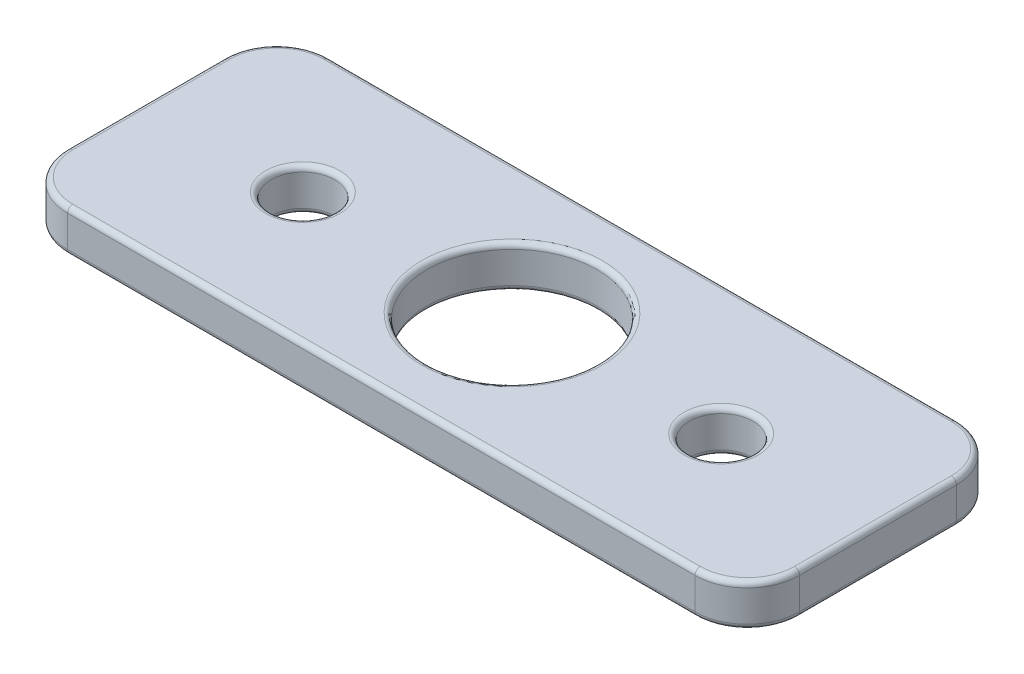
ISO-10303-21;
HEADER;
FILE_DESCRIPTION(('STEP AP214'),'2;1');
FILE_NAME('part.step','',(''),(''),'','','');
FILE_SCHEMA(('AUTOMOTIVE_DESIGN { 1 0 10303 214 1 1 1 1 }'));
ENDSEC;
DATA;
#1=APPLICATION_CONTEXT('core data for automotive mechanical design processes');
#2=APPLICATION_PROTOCOL_DEFINITION('international standard','automotive_design',2000,#1);
#3=PRODUCT_CONTEXT('',#1,'mechanical');
#4=PRODUCT('Part','Part','',(#3));
#5=PRODUCT_RELATED_PRODUCT_CATEGORY('part','',(#4));
#6=PRODUCT_DEFINITION_FORMATION('','',#4);
#7=PRODUCT_DEFINITION_CONTEXT('part definition',#1,'design');
#8=PRODUCT_DEFINITION('design','',#6,#7);
#9=PRODUCT_DEFINITION_SHAPE('','',#8);
#10=(LENGTH_UNIT() NAMED_UNIT(*) SI_UNIT(.MILLI.,.METRE.));
#11=(NAMED_UNIT(*) PLANE_ANGLE_UNIT() SI_UNIT($,.RADIAN.));
#12=(NAMED_UNIT(*) SI_UNIT($,.STERADIAN.) SOLID_ANGLE_UNIT());
#13=UNCERTAINTY_MEASURE_WITH_UNIT(LENGTH_MEASURE(1.E-05),#10,'distance_accuracy_value','');
#14=(GEOMETRIC_REPRESENTATION_CONTEXT(3) GLOBAL_UNCERTAINTY_ASSIGNED_CONTEXT((#13)) GLOBAL_UNIT_ASSIGNED_CONTEXT((#10,
#11,#12)) REPRESENTATION_CONTEXT('',''));
#15=CARTESIAN_POINT('',(0.,0.,0.));
#16=DIRECTION('',(0.,0.,1.));
#17=DIRECTION('',(1.,0.,0.));
#18=AXIS2_PLACEMENT_3D('',#15,#16,#17);
#19=CARTESIAN_POINT('',(0.,4.,0.));
#20=DIRECTION('',(0.,-1.,0.));
#21=DIRECTION('',(0.,0.,-1.));
#22=AXIS2_PLACEMENT_3D('',#19,#20,#21);
#23=PLANE('',#22);
#24=CARTESIAN_POINT('',(55.,4.,-12.5));
#25=DIRECTION('',(0.,-1.,0.));
#26=DIRECTION('',(0.,0.,-1.));
#27=AXIS2_PLACEMENT_3D('',#24,#25,#26);
#28=CIRCLE('',#27,3.55000000000001);
#29=CARTESIAN_POINT('',(55.,4.,-16.05));
#30=VERTEX_POINT('',#29);
#31=EDGE_CURVE('E11',#30,#30,#28,.T.);
#32=ORIENTED_EDGE('',*,*,#31,.T.);
#33=EDGE_LOOP('',(#32));
#34=FACE_BOUND('',#33,.T.);
#35=CARTESIAN_POINT('',(35.,4.,-12.5));
#36=DIRECTION('',(0.,-1.,0.));
#37=DIRECTION('',(0.,0.,-1.));
#38=AXIS2_PLACEMENT_3D('',#35,#36,#37);
#39=CIRCLE('',#38,8.65);
#40=CARTESIAN_POINT('',(35.,4.,-21.15));
#41=VERTEX_POINT('',#40);
#42=EDGE_CURVE('E47',#41,#41,#39,.T.);
#43=ORIENTED_EDGE('',*,*,#42,.T.);
#44=EDGE_LOOP('',(#43));
#45=FACE_BOUND('',#44,.T.);
#46=CARTESIAN_POINT('',(15.,4.,-12.5));
#47=DIRECTION('',(0.,-1.,0.));
#48=DIRECTION('',(0.,0.,-1.));
#49=AXIS2_PLACEMENT_3D('',#46,#47,#48);
#50=CIRCLE('',#49,3.55);
#51=CARTESIAN_POINT('',(15.,4.,-16.05));
#52=VERTEX_POINT('',#51);
#53=EDGE_CURVE('E255',#52,#52,#50,.T.);
#54=ORIENTED_EDGE('',*,*,#53,.T.);
#55=EDGE_LOOP('',(#54));
#56=FACE_BOUND('',#55,.T.);
#57=DIRECTION('',(1.,0.,0.));
#58=VECTOR('',#57,1.);
#59=CARTESIAN_POINT('',(0.,4.,-0.5));
#60=LINE('',#59,#58);
#61=CARTESIAN_POINT('',(5.,4.,-0.5));
#62=VERTEX_POINT('',#61);
#63=CARTESIAN_POINT('',(65.,4.,-0.5));
#64=VERTEX_POINT('',#63);
#65=EDGE_CURVE('E55',#62,#64,#60,.T.);
#66=ORIENTED_EDGE('',*,*,#65,.T.);
#67=CARTESIAN_POINT('',(65.,4.,-5.));
#68=DIRECTION('',(0.,-1.,0.));
#69=DIRECTION('',(0.,0.,-1.));
#70=AXIS2_PLACEMENT_3D('',#67,#68,#69);
#71=CIRCLE('',#70,4.5);
#72=CARTESIAN_POINT('',(69.5,4.,-5.));
#73=VERTEX_POINT('',#72);
#74=EDGE_CURVE('E253',#64,#73,#71,.F.);
#75=ORIENTED_EDGE('',*,*,#74,.T.);
#76=DIRECTION('',(0.,0.,-1.));
#77=VECTOR('',#76,1.);
#78=CARTESIAN_POINT('',(69.5,4.,0.));
#79=LINE('',#78,#77);
#80=CARTESIAN_POINT('',(69.5,4.,-20.));
#81=VERTEX_POINT('',#80);
#82=EDGE_CURVE('E241',#73,#81,#79,.T.);
#83=ORIENTED_EDGE('',*,*,#82,.T.);
#84=CARTESIAN_POINT('',(65.,4.,-20.));
#85=DIRECTION('',(0.,-1.,0.));
#86=DIRECTION('',(0.,0.,-1.));
#87=AXIS2_PLACEMENT_3D('',#84,#85,#86);
#88=CIRCLE('',#87,4.5);
#89=CARTESIAN_POINT('',(65.,4.,-24.5));
#90=VERTEX_POINT('',#89);
#91=EDGE_CURVE('E243',#81,#90,#88,.F.);
#92=ORIENTED_EDGE('',*,*,#91,.T.);
#93=DIRECTION('',(-1.,0.,0.));
#94=VECTOR('',#93,1.);
#95=CARTESIAN_POINT('',(0.,4.,-24.5));
#96=LINE('',#95,#94);
#97=CARTESIAN_POINT('',(5.,4.,-24.5));
#98=VERTEX_POINT('',#97);
#99=EDGE_CURVE('E245',#90,#98,#96,.T.);
#100=ORIENTED_EDGE('',*,*,#99,.T.);
#101=CARTESIAN_POINT('',(5.,4.,-20.));
#102=DIRECTION('',(0.,-1.,0.));
#103=DIRECTION('',(0.,0.,-1.));
#104=AXIS2_PLACEMENT_3D('',#101,#102,#103);
#105=CIRCLE('',#104,4.5);
#106=CARTESIAN_POINT('',(0.5,4.,-20.));
#107=VERTEX_POINT('',#106);
#108=EDGE_CURVE('E247',#98,#107,#105,.F.);
#109=ORIENTED_EDGE('',*,*,#108,.T.);
#110=DIRECTION('',(0.,0.,1.));
#111=VECTOR('',#110,1.);
#112=CARTESIAN_POINT('',(0.5,4.,0.));
#113=LINE('',#112,#111);
#114=CARTESIAN_POINT('',(0.5,4.,-5.));
#115=VERTEX_POINT('',#114);
#116=EDGE_CURVE('E249',#107,#115,#113,.T.);
#117=ORIENTED_EDGE('',*,*,#116,.T.);
#118=CARTESIAN_POINT('',(5.,4.,-5.));
#119=DIRECTION('',(0.,-1.,0.));
#120=DIRECTION('',(0.,0.,-1.));
#121=AXIS2_PLACEMENT_3D('',#118,#119,#120);
#122=CIRCLE('',#121,4.5);
#123=EDGE_CURVE('E60',#115,#62,#122,.F.);
#124=ORIENTED_EDGE('',*,*,#123,.T.);
#125=EDGE_LOOP('',(#66,#75,#83,#92,#100,#109,#117,#124));
#126=FACE_BOUND('',#125,.T.);
#127=ADVANCED_FACE('F38',(#34,#45,#56,#126),#23,.F.);
#128=CARTESIAN_POINT('',(0.,0.,0.));
#129=DIRECTION('',(0.,-1.,0.));
#130=DIRECTION('',(0.,0.,-1.));
#131=AXIS2_PLACEMENT_3D('',#128,#129,#130);
#132=PLANE('',#131);
#133=CARTESIAN_POINT('',(55.,0.,-12.5));
#134=DIRECTION('',(0.,-1.,0.));
#135=DIRECTION('',(0.,0.,-1.));
#136=AXIS2_PLACEMENT_3D('',#133,#134,#135);
#137=CIRCLE('',#136,3.55000000000001);
#138=CARTESIAN_POINT('',(55.,0.,-16.05));
#139=VERTEX_POINT('',#138);
#140=EDGE_CURVE('E183',#139,#139,#137,.F.);
#141=ORIENTED_EDGE('',*,*,#140,.T.);
#142=EDGE_LOOP('',(#141));
#143=FACE_BOUND('',#142,.T.);
#144=CARTESIAN_POINT('',(15.,0.,-12.5));
#145=DIRECTION('',(0.,-1.,0.));
#146=DIRECTION('',(0.,0.,-1.));
#147=AXIS2_PLACEMENT_3D('',#144,#145,#146);
#148=CIRCLE('',#147,3.55);
#149=CARTESIAN_POINT('',(15.,0.,-16.05));
#150=VERTEX_POINT('',#149);
#151=EDGE_CURVE('E180',#150,#150,#148,.F.);
#152=ORIENTED_EDGE('',*,*,#151,.T.);
#153=EDGE_LOOP('',(#152));
#154=FACE_BOUND('',#153,.T.);
#155=DIRECTION('',(0.,0.,1.));
#156=VECTOR('',#155,1.);
#157=CARTESIAN_POINT('',(0.5,0.,-20.));
#158=LINE('',#157,#156);
#159=CARTESIAN_POINT('',(0.5,0.,-5.));
#160=VERTEX_POINT('',#159);
#161=CARTESIAN_POINT('',(0.5,0.,-20.));
#162=VERTEX_POINT('',#161);
#163=EDGE_CURVE('E178',#160,#162,#158,.F.);
#164=ORIENTED_EDGE('',*,*,#163,.T.);
#165=CARTESIAN_POINT('',(5.,0.,-20.));
#166=DIRECTION('',(0.,-1.,0.));
#167=DIRECTION('',(0.,0.,-1.));
#168=AXIS2_PLACEMENT_3D('',#165,#166,#167);
#169=CIRCLE('',#168,4.5);
#170=CARTESIAN_POINT('',(5.,0.,-24.5));
#171=VERTEX_POINT('',#170);
#172=EDGE_CURVE('E158',#162,#171,#169,.T.);
#173=ORIENTED_EDGE('',*,*,#172,.T.);
#174=DIRECTION('',(-1.,0.,0.));
#175=VECTOR('',#174,1.);
#176=CARTESIAN_POINT('',(65.,0.,-24.5));
#177=LINE('',#176,#175);
#178=CARTESIAN_POINT('',(65.,0.,-24.5));
#179=VERTEX_POINT('',#178);
#180=EDGE_CURVE('E166',#171,#179,#177,.F.);
#181=ORIENTED_EDGE('',*,*,#180,.T.);
#182=CARTESIAN_POINT('',(65.,0.,-20.));
#183=DIRECTION('',(0.,-1.,0.));
#184=DIRECTION('',(0.,0.,-1.));
#185=AXIS2_PLACEMENT_3D('',#182,#183,#184);
#186=CIRCLE('',#185,4.5);
#187=CARTESIAN_POINT('',(69.5,0.,-20.));
#188=VERTEX_POINT('',#187);
#189=EDGE_CURVE('E172',#179,#188,#186,.T.);
#190=ORIENTED_EDGE('',*,*,#189,.T.);
#191=DIRECTION('',(0.,0.,-1.));
#192=VECTOR('',#191,1.);
#193=CARTESIAN_POINT('',(69.5,0.,-5.));
#194=LINE('',#193,#192);
#195=CARTESIAN_POINT('',(69.5,0.,-5.));
#196=VERTEX_POINT('',#195);
#197=EDGE_CURVE('E343',#188,#196,#194,.F.);
#198=ORIENTED_EDGE('',*,*,#197,.T.);
#199=CARTESIAN_POINT('',(65.,0.,-5.));
#200=DIRECTION('',(0.,-1.,0.));
#201=DIRECTION('',(0.,0.,-1.));
#202=AXIS2_PLACEMENT_3D('',#199,#200,#201);
#203=CIRCLE('',#202,4.5);
#204=CARTESIAN_POINT('',(65.,0.,-0.5));
#205=VERTEX_POINT('',#204);
#206=EDGE_CURVE('E345',#196,#205,#203,.T.);
#207=ORIENTED_EDGE('',*,*,#206,.T.);
#208=DIRECTION('',(1.,0.,0.));
#209=VECTOR('',#208,1.);
#210=CARTESIAN_POINT('',(5.,0.,-0.5));
#211=LINE('',#210,#209);
#212=CARTESIAN_POINT('',(5.,0.,-0.5));
#213=VERTEX_POINT('',#212);
#214=EDGE_CURVE('E347',#205,#213,#211,.F.);
#215=ORIENTED_EDGE('',*,*,#214,.T.);
#216=CARTESIAN_POINT('',(5.,0.,-5.));
#217=DIRECTION('',(0.,-1.,0.));
#218=DIRECTION('',(0.,0.,-1.));
#219=AXIS2_PLACEMENT_3D('',#216,#217,#218);
#220=CIRCLE('',#219,4.5);
#221=EDGE_CURVE('E185',#213,#160,#220,.T.);
#222=ORIENTED_EDGE('',*,*,#221,.T.);
#223=EDGE_LOOP('',(#164,#173,#181,#190,#198,#207,#215,#222));
#224=FACE_BOUND('',#223,.T.);
#225=CARTESIAN_POINT('',(35.,0.,-12.5));
#226=DIRECTION('',(0.,-1.,0.));
#227=DIRECTION('',(0.,0.,-1.));
#228=AXIS2_PLACEMENT_3D('',#225,#226,#227);
#229=CIRCLE('',#228,8.65);
#230=CARTESIAN_POINT('',(35.,0.,-21.15));
#231=VERTEX_POINT('',#230);
#232=EDGE_CURVE('E173',#231,#231,#229,.F.);
#233=ORIENTED_EDGE('',*,*,#232,.T.);
#234=EDGE_LOOP('',(#233));
#235=FACE_BOUND('',#234,.T.);
#236=ADVANCED_FACE('F175',(#143,#154,#224,#235),#132,.T.);
#237=CARTESIAN_POINT('',(0.,4.,0.));
#238=DIRECTION('',(1.,0.,0.));
#239=DIRECTION('',(0.,0.,-1.));
#240=AXIS2_PLACEMENT_3D('',#237,#238,#239);
#241=PLANE('',#240);
#242=DIRECTION('',(0.,-1.,0.));
#243=VECTOR('',#242,1.);
#244=CARTESIAN_POINT('',(0.,4.,-20.));
#245=LINE('',#244,#243);
#246=CARTESIAN_POINT('',(0.,3.5,-20.));
#247=VERTEX_POINT('',#246);
#248=CARTESIAN_POINT('',(0.,0.5,-20.));
#249=VERTEX_POINT('',#248);
#250=EDGE_CURVE('E315',#247,#249,#245,.T.);
#251=ORIENTED_EDGE('',*,*,#250,.T.);
#252=DIRECTION('',(0.,0.,1.));
#253=VECTOR('',#252,1.);
#254=CARTESIAN_POINT('',(0.,0.5,-5.));
#255=LINE('',#254,#253);
#256=CARTESIAN_POINT('',(0.,0.5,-5.));
#257=VERTEX_POINT('',#256);
#258=EDGE_CURVE('E208',#249,#257,#255,.T.);
#259=ORIENTED_EDGE('',*,*,#258,.T.);
#260=DIRECTION('',(0.,-1.,0.));
#261=VECTOR('',#260,1.);
#262=CARTESIAN_POINT('',(0.,4.,-5.));
#263=LINE('',#262,#261);
#264=CARTESIAN_POINT('',(0.,3.5,-5.));
#265=VERTEX_POINT('',#264);
#266=EDGE_CURVE('E330',#257,#265,#263,.F.);
#267=ORIENTED_EDGE('',*,*,#266,.T.);
#268=DIRECTION('',(0.,0.,1.));
#269=VECTOR('',#268,1.);
#270=CARTESIAN_POINT('',(0.,3.5,0.));
#271=LINE('',#270,#269);
#272=EDGE_CURVE('E206',#265,#247,#271,.F.);
#273=ORIENTED_EDGE('',*,*,#272,.T.);
#274=EDGE_LOOP('',(#251,#259,#267,#273));
#275=FACE_BOUND('',#274,.T.);
#276=ADVANCED_FACE('F360',(#275),#241,.F.);
#277=CARTESIAN_POINT('',(0.,4.,0.));
#278=DIRECTION('',(0.,0.,-1.));
#279=DIRECTION('',(-1.,0.,0.));
#280=AXIS2_PLACEMENT_3D('',#277,#278,#279);
#281=PLANE('',#280);
#282=DIRECTION('',(0.,-1.,0.));
#283=VECTOR('',#282,1.);
#284=CARTESIAN_POINT('',(5.,4.,0.));
#285=LINE('',#284,#283);
#286=CARTESIAN_POINT('',(5.,3.5,0.));
#287=VERTEX_POINT('',#286);
#288=CARTESIAN_POINT('',(5.,0.5,0.));
#289=VERTEX_POINT('',#288);
#290=EDGE_CURVE('E337',#287,#289,#285,.T.);
#291=ORIENTED_EDGE('',*,*,#290,.T.);
#292=DIRECTION('',(1.,0.,0.));
#293=VECTOR('',#292,1.);
#294=CARTESIAN_POINT('',(65.,0.5,0.));
#295=LINE('',#294,#293);
#296=CARTESIAN_POINT('',(65.,0.5,0.));
#297=VERTEX_POINT('',#296);
#298=EDGE_CURVE('E216',#289,#297,#295,.T.);
#299=ORIENTED_EDGE('',*,*,#298,.T.);
#300=DIRECTION('',(0.,-1.,0.));
#301=VECTOR('',#300,1.);
#302=CARTESIAN_POINT('',(65.,4.,0.));
#303=LINE('',#302,#301);
#304=CARTESIAN_POINT('',(65.,3.5,0.));
#305=VERTEX_POINT('',#304);
#306=EDGE_CURVE('E334',#297,#305,#303,.F.);
#307=ORIENTED_EDGE('',*,*,#306,.T.);
#308=DIRECTION('',(1.,0.,0.));
#309=VECTOR('',#308,1.);
#310=CARTESIAN_POINT('',(0.,3.5,0.));
#311=LINE('',#310,#309);
#312=EDGE_CURVE('E214',#305,#287,#311,.F.);
#313=ORIENTED_EDGE('',*,*,#312,.T.);
#314=EDGE_LOOP('',(#291,#299,#307,#313));
#315=FACE_BOUND('',#314,.T.);
#316=ADVANCED_FACE('F403',(#315),#281,.F.);
#317=CARTESIAN_POINT('',(70.,4.,0.));
#318=DIRECTION('',(-1.,0.,0.));
#319=DIRECTION('',(0.,0.,1.));
#320=AXIS2_PLACEMENT_3D('',#317,#318,#319);
#321=PLANE('',#320);
#322=DIRECTION('',(0.,-1.,0.));
#323=VECTOR('',#322,1.);
#324=CARTESIAN_POINT('',(70.,4.,-5.));
#325=LINE('',#324,#323);
#326=CARTESIAN_POINT('',(70.,3.5,-5.));
#327=VERTEX_POINT('',#326);
#328=CARTESIAN_POINT('',(70.,0.5,-5.));
#329=VERTEX_POINT('',#328);
#330=EDGE_CURVE('E322',#327,#329,#325,.T.);
#331=ORIENTED_EDGE('',*,*,#330,.T.);
#332=DIRECTION('',(0.,0.,-1.));
#333=VECTOR('',#332,1.);
#334=CARTESIAN_POINT('',(70.,0.5,-20.));
#335=LINE('',#334,#333);
#336=CARTESIAN_POINT('',(70.,0.5,-20.));
#337=VERTEX_POINT('',#336);
#338=EDGE_CURVE('E225',#329,#337,#335,.T.);
#339=ORIENTED_EDGE('',*,*,#338,.T.);
#340=DIRECTION('',(0.,-1.,0.));
#341=VECTOR('',#340,1.);
#342=CARTESIAN_POINT('',(70.,4.,-20.));
#343=LINE('',#342,#341);
#344=CARTESIAN_POINT('',(70.,3.5,-20.));
#345=VERTEX_POINT('',#344);
#346=EDGE_CURVE('E327',#337,#345,#343,.F.);
#347=ORIENTED_EDGE('',*,*,#346,.T.);
#348=DIRECTION('',(0.,0.,-1.));
#349=VECTOR('',#348,1.);
#350=CARTESIAN_POINT('',(70.,3.5,0.));
#351=LINE('',#350,#349);
#352=EDGE_CURVE('E223',#345,#327,#351,.F.);
#353=ORIENTED_EDGE('',*,*,#352,.T.);
#354=EDGE_LOOP('',(#331,#339,#347,#353));
#355=FACE_BOUND('',#354,.T.);
#356=ADVANCED_FACE('F387',(#355),#321,.F.);
#357=CARTESIAN_POINT('',(0.,4.,-25.));
#358=DIRECTION('',(0.,0.,1.));
#359=DIRECTION('',(1.,0.,0.));
#360=AXIS2_PLACEMENT_3D('',#357,#358,#359);
#361=PLANE('',#360);
#362=DIRECTION('',(0.,-1.,0.));
#363=VECTOR('',#362,1.);
#364=CARTESIAN_POINT('',(65.,4.,-25.));
#365=LINE('',#364,#363);
#366=CARTESIAN_POINT('',(65.,3.5,-25.));
#367=VERTEX_POINT('',#366);
#368=CARTESIAN_POINT('',(65.,0.5,-25.));
#369=VERTEX_POINT('',#368);
#370=EDGE_CURVE('E320',#367,#369,#365,.T.);
#371=ORIENTED_EDGE('',*,*,#370,.T.);
#372=DIRECTION('',(-1.,0.,0.));
#373=VECTOR('',#372,1.);
#374=CARTESIAN_POINT('',(5.,0.5,-25.));
#375=LINE('',#374,#373);
#376=CARTESIAN_POINT('',(5.,0.5,-25.));
#377=VERTEX_POINT('',#376);
#378=EDGE_CURVE('E233',#369,#377,#375,.T.);
#379=ORIENTED_EDGE('',*,*,#378,.T.);
#380=DIRECTION('',(0.,-1.,0.));
#381=VECTOR('',#380,1.);
#382=CARTESIAN_POINT('',(5.,4.,-25.));
#383=LINE('',#382,#381);
#384=CARTESIAN_POINT('',(5.,3.5,-25.));
#385=VERTEX_POINT('',#384);
#386=EDGE_CURVE('E277',#377,#385,#383,.F.);
#387=ORIENTED_EDGE('',*,*,#386,.T.);
#388=DIRECTION('',(-1.,0.,0.));
#389=VECTOR('',#388,1.);
#390=CARTESIAN_POINT('',(0.,3.5,-25.));
#391=LINE('',#390,#389);
#392=EDGE_CURVE('E231',#385,#367,#391,.F.);
#393=ORIENTED_EDGE('',*,*,#392,.T.);
#394=EDGE_LOOP('',(#371,#379,#387,#393));
#395=FACE_BOUND('',#394,.T.);
#396=ADVANCED_FACE('F318',(#395),#361,.F.);
#397=CARTESIAN_POINT('',(15.,4.,-12.5));
#398=DIRECTION('',(0.,-1.,0.));
#399=DIRECTION('',(0.,0.,-1.));
#400=AXIS2_PLACEMENT_3D('',#397,#398,#399);
#401=CYLINDRICAL_SURFACE('',#400,3.05);
#402=CARTESIAN_POINT('',(15.,0.5,-12.5));
#403=DIRECTION('',(0.,-1.,0.));
#404=DIRECTION('',(0.,0.,-1.));
#405=AXIS2_PLACEMENT_3D('',#402,#403,#404);
#406=CIRCLE('',#405,3.05);
#407=CARTESIAN_POINT('',(15.,0.5,-15.55));
#408=VERTEX_POINT('',#407);
#409=EDGE_CURVE('E200',#408,#408,#406,.T.);
#410=ORIENTED_EDGE('',*,*,#409,.T.);
#411=EDGE_LOOP('',(#410));
#412=FACE_BOUND('',#411,.T.);
#413=CARTESIAN_POINT('',(15.,3.5,-12.5));
#414=DIRECTION('',(0.,-1.,0.));
#415=DIRECTION('',(0.,0.,-1.));
#416=AXIS2_PLACEMENT_3D('',#413,#414,#415);
#417=CIRCLE('',#416,3.05);
#418=CARTESIAN_POINT('',(15.,3.5,-15.55));
#419=VERTEX_POINT('',#418);
#420=EDGE_CURVE('E197',#419,#419,#417,.F.);
#421=ORIENTED_EDGE('',*,*,#420,.T.);
#422=EDGE_LOOP('',(#421));
#423=FACE_BOUND('',#422,.T.);
#424=ADVANCED_FACE('F422',(#412,#423),#401,.F.);
#425=CARTESIAN_POINT('',(35.,4.,-12.5));
#426=DIRECTION('',(0.,-1.,0.));
#427=DIRECTION('',(0.,0.,-1.));
#428=AXIS2_PLACEMENT_3D('',#425,#426,#427);
#429=CYLINDRICAL_SURFACE('',#428,8.15);
#430=CARTESIAN_POINT('',(35.,0.5,-12.5));
#431=DIRECTION('',(0.,-1.,0.));
#432=DIRECTION('',(0.,0.,-1.));
#433=AXIS2_PLACEMENT_3D('',#430,#431,#432);
#434=CIRCLE('',#433,8.15);
#435=CARTESIAN_POINT('',(35.,0.5,-20.65));
#436=VERTEX_POINT('',#435);
#437=EDGE_CURVE('E238',#436,#436,#434,.T.);
#438=ORIENTED_EDGE('',*,*,#437,.T.);
#439=EDGE_LOOP('',(#438));
#440=FACE_BOUND('',#439,.T.);
#441=CARTESIAN_POINT('',(35.,3.5,-12.5));
#442=DIRECTION('',(0.,-1.,0.));
#443=DIRECTION('',(0.,0.,-1.));
#444=AXIS2_PLACEMENT_3D('',#441,#442,#443);
#445=CIRCLE('',#444,8.15);
#446=CARTESIAN_POINT('',(35.,3.5,-20.65));
#447=VERTEX_POINT('',#446);
#448=EDGE_CURVE('E235',#447,#447,#445,.F.);
#449=ORIENTED_EDGE('',*,*,#448,.T.);
#450=EDGE_LOOP('',(#449));
#451=FACE_BOUND('',#450,.T.);
#452=ADVANCED_FACE('F429',(#440,#451),#429,.F.);
#453=CARTESIAN_POINT('',(55.,4.,-12.5));
#454=DIRECTION('',(0.,-1.,0.));
#455=DIRECTION('',(0.,0.,-1.));
#456=AXIS2_PLACEMENT_3D('',#453,#454,#455);
#457=CYLINDRICAL_SURFACE('',#456,3.05000000000001);
#458=CARTESIAN_POINT('',(55.,0.5,-12.5));
#459=DIRECTION('',(0.,-1.,0.));
#460=DIRECTION('',(0.,0.,-1.));
#461=AXIS2_PLACEMENT_3D('',#458,#459,#460);
#462=CIRCLE('',#461,3.05000000000001);
#463=CARTESIAN_POINT('',(55.,0.5,-15.55));
#464=VERTEX_POINT('',#463);
#465=EDGE_CURVE('E194',#464,#464,#462,.T.);
#466=ORIENTED_EDGE('',*,*,#465,.T.);
#467=EDGE_LOOP('',(#466));
#468=FACE_BOUND('',#467,.T.);
#469=CARTESIAN_POINT('',(55.,3.5,-12.5));
#470=DIRECTION('',(0.,-1.,0.));
#471=DIRECTION('',(0.,0.,-1.));
#472=AXIS2_PLACEMENT_3D('',#469,#470,#471);
#473=CIRCLE('',#472,3.05000000000001);
#474=CARTESIAN_POINT('',(55.,3.5,-15.55));
#475=VERTEX_POINT('',#474);
#476=EDGE_CURVE('E191',#475,#475,#473,.F.);
#477=ORIENTED_EDGE('',*,*,#476,.T.);
#478=EDGE_LOOP('',(#477));
#479=FACE_BOUND('',#478,.T.);
#480=ADVANCED_FACE('F434',(#468,#479),#457,.F.);
#481=CARTESIAN_POINT('',(65.,4.,-20.));
#482=DIRECTION('',(0.,-1.,0.));
#483=DIRECTION('',(0.,0.,-1.));
#484=AXIS2_PLACEMENT_3D('',#481,#482,#483);
#485=CYLINDRICAL_SURFACE('',#484,5.);
#486=ORIENTED_EDGE('',*,*,#346,.F.);
#487=CARTESIAN_POINT('',(65.,0.5,-20.));
#488=DIRECTION('',(0.,-1.,0.));
#489=DIRECTION('',(0.,0.,-1.));
#490=AXIS2_PLACEMENT_3D('',#487,#488,#489);
#491=CIRCLE('',#490,5.);
#492=EDGE_CURVE('E229',#337,#369,#491,.F.);
#493=ORIENTED_EDGE('',*,*,#492,.T.);
#494=ORIENTED_EDGE('',*,*,#370,.F.);
#495=CARTESIAN_POINT('',(65.,3.5,-20.));
#496=DIRECTION('',(0.,-1.,0.));
#497=DIRECTION('',(0.,0.,-1.));
#498=AXIS2_PLACEMENT_3D('',#495,#496,#497);
#499=CIRCLE('',#498,5.);
#500=EDGE_CURVE('E227',#367,#345,#499,.T.);
#501=ORIENTED_EDGE('',*,*,#500,.T.);
#502=EDGE_LOOP('',(#486,#493,#494,#501));
#503=FACE_BOUND('',#502,.T.);
#504=ADVANCED_FACE('F639',(#503),#485,.T.);
#505=CARTESIAN_POINT('',(5.,4.,-20.));
#506=DIRECTION('',(0.,-1.,0.));
#507=DIRECTION('',(0.,0.,-1.));
#508=AXIS2_PLACEMENT_3D('',#505,#506,#507);
#509=CYLINDRICAL_SURFACE('',#508,5.);
#510=ORIENTED_EDGE('',*,*,#386,.F.);
#511=CARTESIAN_POINT('',(5.,0.5,-20.));
#512=DIRECTION('',(0.,-1.,0.));
#513=DIRECTION('',(0.,0.,-1.));
#514=AXIS2_PLACEMENT_3D('',#511,#512,#513);
#515=CIRCLE('',#514,5.);
#516=EDGE_CURVE('E160',#377,#249,#515,.F.);
#517=ORIENTED_EDGE('',*,*,#516,.T.);
#518=ORIENTED_EDGE('',*,*,#250,.F.);
#519=CARTESIAN_POINT('',(5.,3.5,-20.));
#520=DIRECTION('',(0.,-1.,0.));
#521=DIRECTION('',(0.,0.,-1.));
#522=AXIS2_PLACEMENT_3D('',#519,#520,#521);
#523=CIRCLE('',#522,5.);
#524=EDGE_CURVE('E203',#247,#385,#523,.T.);
#525=ORIENTED_EDGE('',*,*,#524,.T.);
#526=EDGE_LOOP('',(#510,#517,#518,#525));
#527=FACE_BOUND('',#526,.T.);
#528=ADVANCED_FACE('F313',(#527),#509,.T.);
#529=CARTESIAN_POINT('',(5.,4.,-5.));
#530=DIRECTION('',(0.,-1.,0.));
#531=DIRECTION('',(0.,0.,-1.));
#532=AXIS2_PLACEMENT_3D('',#529,#530,#531);
#533=CYLINDRICAL_SURFACE('',#532,5.);
#534=ORIENTED_EDGE('',*,*,#266,.F.);
#535=CARTESIAN_POINT('',(5.,0.5,-5.));
#536=DIRECTION('',(0.,-1.,0.));
#537=DIRECTION('',(0.,0.,-1.));
#538=AXIS2_PLACEMENT_3D('',#535,#536,#537);
#539=CIRCLE('',#538,5.);
#540=EDGE_CURVE('E212',#257,#289,#539,.F.);
#541=ORIENTED_EDGE('',*,*,#540,.T.);
#542=ORIENTED_EDGE('',*,*,#290,.F.);
#543=CARTESIAN_POINT('',(5.,3.5,-5.));
#544=DIRECTION('',(0.,-1.,0.));
#545=DIRECTION('',(0.,0.,-1.));
#546=AXIS2_PLACEMENT_3D('',#543,#544,#545);
#547=CIRCLE('',#546,5.);
#548=EDGE_CURVE('E210',#287,#265,#547,.T.);
#549=ORIENTED_EDGE('',*,*,#548,.T.);
#550=EDGE_LOOP('',(#534,#541,#542,#549));
#551=FACE_BOUND('',#550,.T.);
#552=ADVANCED_FACE('F362',(#551),#533,.T.);
#553=CARTESIAN_POINT('',(65.,4.,-5.));
#554=DIRECTION('',(0.,-1.,0.));
#555=DIRECTION('',(0.,0.,-1.));
#556=AXIS2_PLACEMENT_3D('',#553,#554,#555);
#557=CYLINDRICAL_SURFACE('',#556,5.);
#558=ORIENTED_EDGE('',*,*,#306,.F.);
#559=CARTESIAN_POINT('',(65.,0.5,-5.));
#560=DIRECTION('',(0.,-1.,0.));
#561=DIRECTION('',(0.,0.,-1.));
#562=AXIS2_PLACEMENT_3D('',#559,#560,#561);
#563=CIRCLE('',#562,5.);
#564=EDGE_CURVE('E221',#297,#329,#563,.F.);
#565=ORIENTED_EDGE('',*,*,#564,.T.);
#566=ORIENTED_EDGE('',*,*,#330,.F.);
#567=CARTESIAN_POINT('',(65.,3.5,-5.));
#568=DIRECTION('',(0.,-1.,0.));
#569=DIRECTION('',(0.,0.,-1.));
#570=AXIS2_PLACEMENT_3D('',#567,#568,#569);
#571=CIRCLE('',#570,5.);
#572=EDGE_CURVE('E218',#327,#305,#571,.T.);
#573=ORIENTED_EDGE('',*,*,#572,.T.);
#574=EDGE_LOOP('',(#558,#565,#566,#573));
#575=FACE_BOUND('',#574,.T.);
#576=ADVANCED_FACE('F392',(#575),#557,.T.);
#577=CARTESIAN_POINT('',(55.,0.5,-12.5));
#578=DIRECTION('',(0.,-1.,0.));
#579=DIRECTION('',(0.,0.,-1.));
#580=AXIS2_PLACEMENT_3D('',#577,#578,#579);
#581=TOROIDAL_SURFACE('',#580,3.55000000000001,0.5);
#582=ORIENTED_EDGE('',*,*,#465,.F.);
#583=EDGE_LOOP('',(#582));
#584=FACE_BOUND('',#583,.T.);
#585=ORIENTED_EDGE('',*,*,#140,.F.);
#586=EDGE_LOOP('',(#585));
#587=FACE_BOUND('',#586,.T.);
#588=ADVANCED_FACE('F608',(#584,#587),#581,.T.);
#589=CARTESIAN_POINT('',(15.,0.5,-12.5));
#590=DIRECTION('',(0.,-1.,0.));
#591=DIRECTION('',(0.,0.,-1.));
#592=AXIS2_PLACEMENT_3D('',#589,#590,#591);
#593=TOROIDAL_SURFACE('',#592,3.55,0.5);
#594=ORIENTED_EDGE('',*,*,#409,.F.);
#595=EDGE_LOOP('',(#594));
#596=FACE_BOUND('',#595,.T.);
#597=ORIENTED_EDGE('',*,*,#151,.F.);
#598=EDGE_LOOP('',(#597));
#599=FACE_BOUND('',#598,.T.);
#600=ADVANCED_FACE('F600',(#596,#599),#593,.T.);
#601=CARTESIAN_POINT('',(65.,0.5,-5.));
#602=DIRECTION('',(0.,-1.,0.));
#603=DIRECTION('',(0.,0.,-1.));
#604=AXIS2_PLACEMENT_3D('',#601,#602,#603);
#605=TOROIDAL_SURFACE('',#604,4.5,0.5);
#606=CARTESIAN_POINT('',(69.5,0.5,-5.));
#607=DIRECTION('',(0.,0.,-1.));
#608=DIRECTION('',(-1.,0.,0.));
#609=AXIS2_PLACEMENT_3D('',#606,#607,#608);
#610=CIRCLE('',#609,0.5);
#611=EDGE_CURVE('E271',#329,#196,#610,.T.);
#612=ORIENTED_EDGE('',*,*,#611,.F.);
#613=ORIENTED_EDGE('',*,*,#564,.F.);
#614=CARTESIAN_POINT('',(65.,0.5,-0.5));
#615=DIRECTION('',(-1.,0.,0.));
#616=DIRECTION('',(0.,0.,1.));
#617=AXIS2_PLACEMENT_3D('',#614,#615,#616);
#618=CIRCLE('',#617,0.5);
#619=EDGE_CURVE('E274',#205,#297,#618,.T.);
#620=ORIENTED_EDGE('',*,*,#619,.F.);
#621=ORIENTED_EDGE('',*,*,#206,.F.);
#622=EDGE_LOOP('',(#612,#613,#620,#621));
#623=FACE_BOUND('',#622,.T.);
#624=ADVANCED_FACE('F396',(#623),#605,.T.);
#625=CARTESIAN_POINT('',(0.,0.5,-0.5));
#626=DIRECTION('',(-1.,0.,0.));
#627=DIRECTION('',(0.,0.,1.));
#628=AXIS2_PLACEMENT_3D('',#625,#626,#627);
#629=CYLINDRICAL_SURFACE('',#628,0.5);
#630=ORIENTED_EDGE('',*,*,#619,.T.);
#631=ORIENTED_EDGE('',*,*,#298,.F.);
#632=CARTESIAN_POINT('',(5.,0.5,-0.5));
#633=DIRECTION('',(-1.,0.,0.));
#634=DIRECTION('',(0.,0.,1.));
#635=AXIS2_PLACEMENT_3D('',#632,#633,#634);
#636=CIRCLE('',#635,0.5);
#637=EDGE_CURVE('E268',#213,#289,#636,.T.);
#638=ORIENTED_EDGE('',*,*,#637,.F.);
#639=ORIENTED_EDGE('',*,*,#214,.F.);
#640=EDGE_LOOP('',(#630,#631,#638,#639));
#641=FACE_BOUND('',#640,.T.);
#642=ADVANCED_FACE('F401',(#641),#629,.T.);
#643=CARTESIAN_POINT('',(69.5,0.5,0.));
#644=DIRECTION('',(0.,0.,1.));
#645=DIRECTION('',(1.,0.,0.));
#646=AXIS2_PLACEMENT_3D('',#643,#644,#645);
#647=CYLINDRICAL_SURFACE('',#646,0.5);
#648=ORIENTED_EDGE('',*,*,#611,.T.);
#649=ORIENTED_EDGE('',*,*,#197,.F.);
#650=CARTESIAN_POINT('',(69.5,0.5,-20.));
#651=DIRECTION('',(0.,0.,-1.));
#652=DIRECTION('',(-1.,0.,0.));
#653=AXIS2_PLACEMENT_3D('',#650,#651,#652);
#654=CIRCLE('',#653,0.5);
#655=EDGE_CURVE('E265',#337,#188,#654,.T.);
#656=ORIENTED_EDGE('',*,*,#655,.F.);
#657=ORIENTED_EDGE('',*,*,#338,.F.);
#658=EDGE_LOOP('',(#648,#649,#656,#657));
#659=FACE_BOUND('',#658,.T.);
#660=ADVANCED_FACE('F577',(#659),#647,.T.);
#661=CARTESIAN_POINT('',(5.,0.5,-5.));
#662=DIRECTION('',(0.,-1.,0.));
#663=DIRECTION('',(0.,0.,-1.));
#664=AXIS2_PLACEMENT_3D('',#661,#662,#663);
#665=TOROIDAL_SURFACE('',#664,4.5,0.5);
#666=ORIENTED_EDGE('',*,*,#637,.T.);
#667=ORIENTED_EDGE('',*,*,#540,.F.);
#668=CARTESIAN_POINT('',(0.5,0.5,-5.));
#669=DIRECTION('',(0.,0.,-1.));
#670=DIRECTION('',(-1.,0.,0.));
#671=AXIS2_PLACEMENT_3D('',#668,#669,#670);
#672=CIRCLE('',#671,0.5);
#673=EDGE_CURVE('E262',#160,#257,#672,.T.);
#674=ORIENTED_EDGE('',*,*,#673,.F.);
#675=ORIENTED_EDGE('',*,*,#221,.F.);
#676=EDGE_LOOP('',(#666,#667,#674,#675));
#677=FACE_BOUND('',#676,.T.);
#678=ADVANCED_FACE('F354',(#677),#665,.T.);
#679=CARTESIAN_POINT('',(65.,0.5,-20.));
#680=DIRECTION('',(0.,-1.,0.));
#681=DIRECTION('',(0.,0.,-1.));
#682=AXIS2_PLACEMENT_3D('',#679,#680,#681);
#683=TOROIDAL_SURFACE('',#682,4.5,0.5);
#684=ORIENTED_EDGE('',*,*,#655,.T.);
#685=ORIENTED_EDGE('',*,*,#189,.F.);
#686=CARTESIAN_POINT('',(65.,0.5,-24.5));
#687=DIRECTION('',(-1.,0.,0.));
#688=DIRECTION('',(0.,0.,1.));
#689=AXIS2_PLACEMENT_3D('',#686,#687,#688);
#690=CIRCLE('',#689,0.5);
#691=EDGE_CURVE('E169',#369,#179,#690,.T.);
#692=ORIENTED_EDGE('',*,*,#691,.F.);
#693=ORIENTED_EDGE('',*,*,#492,.F.);
#694=EDGE_LOOP('',(#684,#685,#692,#693));
#695=FACE_BOUND('',#694,.T.);
#696=ADVANCED_FACE('F561',(#695),#683,.T.);
#697=CARTESIAN_POINT('',(0.5,0.5,0.));
#698=DIRECTION('',(0.,0.,-1.));
#699=DIRECTION('',(-1.,0.,0.));
#700=AXIS2_PLACEMENT_3D('',#697,#698,#699);
#701=CYLINDRICAL_SURFACE('',#700,0.5);
#702=ORIENTED_EDGE('',*,*,#673,.T.);
#703=ORIENTED_EDGE('',*,*,#258,.F.);
#704=CARTESIAN_POINT('',(0.5,0.5,-20.));
#705=DIRECTION('',(0.,0.,-1.));
#706=DIRECTION('',(-1.,0.,0.));
#707=AXIS2_PLACEMENT_3D('',#704,#705,#706);
#708=CIRCLE('',#707,0.5);
#709=EDGE_CURVE('E163',#162,#249,#708,.T.);
#710=ORIENTED_EDGE('',*,*,#709,.F.);
#711=ORIENTED_EDGE('',*,*,#163,.F.);
#712=EDGE_LOOP('',(#702,#703,#710,#711));
#713=FACE_BOUND('',#712,.T.);
#714=ADVANCED_FACE('F357',(#713),#701,.T.);
#715=CARTESIAN_POINT('',(0.,0.5,-24.5));
#716=DIRECTION('',(1.,0.,0.));
#717=DIRECTION('',(0.,0.,-1.));
#718=AXIS2_PLACEMENT_3D('',#715,#716,#717);
#719=CYLINDRICAL_SURFACE('',#718,0.5);
#720=ORIENTED_EDGE('',*,*,#691,.T.);
#721=ORIENTED_EDGE('',*,*,#180,.F.);
#722=CARTESIAN_POINT('',(5.,0.5,-24.5));
#723=DIRECTION('',(-1.,0.,0.));
#724=DIRECTION('',(0.,0.,1.));
#725=AXIS2_PLACEMENT_3D('',#722,#723,#724);
#726=CIRCLE('',#725,0.5);
#727=EDGE_CURVE('E154',#377,#171,#726,.T.);
#728=ORIENTED_EDGE('',*,*,#727,.F.);
#729=ORIENTED_EDGE('',*,*,#378,.F.);
#730=EDGE_LOOP('',(#720,#721,#728,#729));
#731=FACE_BOUND('',#730,.T.);
#732=ADVANCED_FACE('F167',(#731),#719,.T.);
#733=CARTESIAN_POINT('',(5.,0.5,-20.));
#734=DIRECTION('',(0.,-1.,0.));
#735=DIRECTION('',(0.,0.,-1.));
#736=AXIS2_PLACEMENT_3D('',#733,#734,#735);
#737=TOROIDAL_SURFACE('',#736,4.5,0.5);
#738=ORIENTED_EDGE('',*,*,#709,.T.);
#739=ORIENTED_EDGE('',*,*,#516,.F.);
#740=ORIENTED_EDGE('',*,*,#727,.T.);
#741=ORIENTED_EDGE('',*,*,#172,.F.);
#742=EDGE_LOOP('',(#738,#739,#740,#741));
#743=FACE_BOUND('',#742,.T.);
#744=ADVANCED_FACE('F156',(#743),#737,.T.);
#745=CARTESIAN_POINT('',(35.,0.5,-12.5));
#746=DIRECTION('',(0.,-1.,0.));
#747=DIRECTION('',(0.,0.,-1.));
#748=AXIS2_PLACEMENT_3D('',#745,#746,#747);
#749=TOROIDAL_SURFACE('',#748,8.65,0.5);
#750=ORIENTED_EDGE('',*,*,#437,.F.);
#751=EDGE_LOOP('',(#750));
#752=FACE_BOUND('',#751,.T.);
#753=ORIENTED_EDGE('',*,*,#232,.F.);
#754=EDGE_LOOP('',(#753));
#755=FACE_BOUND('',#754,.T.);
#756=ADVANCED_FACE('F531',(#752,#755),#749,.T.);
#757=CARTESIAN_POINT('',(55.,3.5,-12.5));
#758=DIRECTION('',(0.,-1.,0.));
#759=DIRECTION('',(0.,0.,-1.));
#760=AXIS2_PLACEMENT_3D('',#757,#758,#759);
#761=TOROIDAL_SURFACE('',#760,3.55000000000001,0.5);
#762=ORIENTED_EDGE('',*,*,#31,.F.);
#763=EDGE_LOOP('',(#762));
#764=FACE_BOUND('',#763,.T.);
#765=ORIENTED_EDGE('',*,*,#476,.F.);
#766=EDGE_LOOP('',(#765));
#767=FACE_BOUND('',#766,.T.);
#768=ADVANCED_FACE('F449',(#764,#767),#761,.T.);
#769=CARTESIAN_POINT('',(35.,3.5,-12.5));
#770=DIRECTION('',(0.,-1.,0.));
#771=DIRECTION('',(0.,0.,-1.));
#772=AXIS2_PLACEMENT_3D('',#769,#770,#771);
#773=TOROIDAL_SURFACE('',#772,8.65,0.5);
#774=ORIENTED_EDGE('',*,*,#42,.F.);
#775=EDGE_LOOP('',(#774));
#776=FACE_BOUND('',#775,.T.);
#777=ORIENTED_EDGE('',*,*,#448,.F.);
#778=EDGE_LOOP('',(#777));
#779=FACE_BOUND('',#778,.T.);
#780=ADVANCED_FACE('F442',(#776,#779),#773,.T.);
#781=CARTESIAN_POINT('',(15.,3.5,-12.5));
#782=DIRECTION('',(0.,-1.,0.));
#783=DIRECTION('',(0.,0.,-1.));
#784=AXIS2_PLACEMENT_3D('',#781,#782,#783);
#785=TOROIDAL_SURFACE('',#784,3.55,0.5);
#786=ORIENTED_EDGE('',*,*,#53,.F.);
#787=EDGE_LOOP('',(#786));
#788=FACE_BOUND('',#787,.T.);
#789=ORIENTED_EDGE('',*,*,#420,.F.);
#790=EDGE_LOOP('',(#789));
#791=FACE_BOUND('',#790,.T.);
#792=ADVANCED_FACE('F440',(#788,#791),#785,.T.);
#793=CARTESIAN_POINT('',(5.,3.5,-20.));
#794=DIRECTION('',(0.,-1.,0.));
#795=DIRECTION('',(0.,0.,-1.));
#796=AXIS2_PLACEMENT_3D('',#793,#794,#795);
#797=TOROIDAL_SURFACE('',#796,4.5,0.5);
#798=CARTESIAN_POINT('',(5.,3.5,-24.5));
#799=DIRECTION('',(1.,0.,0.));
#800=DIRECTION('',(0.,0.,-1.));
#801=AXIS2_PLACEMENT_3D('',#798,#799,#800);
#802=CIRCLE('',#801,0.5);
#803=EDGE_CURVE('E293',#385,#98,#802,.T.);
#804=ORIENTED_EDGE('',*,*,#803,.F.);
#805=ORIENTED_EDGE('',*,*,#524,.F.);
#806=CARTESIAN_POINT('',(0.5,3.5,-20.));
#807=DIRECTION('',(0.,0.,1.));
#808=DIRECTION('',(1.,0.,0.));
#809=AXIS2_PLACEMENT_3D('',#806,#807,#808);
#810=CIRCLE('',#809,0.5);
#811=EDGE_CURVE('E42',#107,#247,#810,.T.);
#812=ORIENTED_EDGE('',*,*,#811,.F.);
#813=ORIENTED_EDGE('',*,*,#108,.F.);
#814=EDGE_LOOP('',(#804,#805,#812,#813));
#815=FACE_BOUND('',#814,.T.);
#816=ADVANCED_FACE('F40',(#815),#797,.T.);
#817=CARTESIAN_POINT('',(0.5,3.5,0.));
#818=DIRECTION('',(0.,0.,1.));
#819=DIRECTION('',(1.,0.,0.));
#820=AXIS2_PLACEMENT_3D('',#817,#818,#819);
#821=CYLINDRICAL_SURFACE('',#820,0.5);
#822=ORIENTED_EDGE('',*,*,#811,.T.);
#823=ORIENTED_EDGE('',*,*,#272,.F.);
#824=CARTESIAN_POINT('',(0.5,3.5,-5.));
#825=DIRECTION('',(0.,0.,1.));
#826=DIRECTION('',(1.,0.,0.));
#827=AXIS2_PLACEMENT_3D('',#824,#825,#826);
#828=CIRCLE('',#827,0.5);
#829=EDGE_CURVE('E291',#115,#265,#828,.T.);
#830=ORIENTED_EDGE('',*,*,#829,.F.);
#831=ORIENTED_EDGE('',*,*,#116,.F.);
#832=EDGE_LOOP('',(#822,#823,#830,#831));
#833=FACE_BOUND('',#832,.T.);
#834=ADVANCED_FACE('F304',(#833),#821,.T.);
#835=CARTESIAN_POINT('',(0.,3.5,-24.5));
#836=DIRECTION('',(-1.,0.,0.));
#837=DIRECTION('',(0.,0.,1.));
#838=AXIS2_PLACEMENT_3D('',#835,#836,#837);
#839=CYLINDRICAL_SURFACE('',#838,0.5);
#840=ORIENTED_EDGE('',*,*,#803,.T.);
#841=ORIENTED_EDGE('',*,*,#99,.F.);
#842=CARTESIAN_POINT('',(65.,3.5,-24.5));
#843=DIRECTION('',(1.,0.,0.));
#844=DIRECTION('',(0.,0.,-1.));
#845=AXIS2_PLACEMENT_3D('',#842,#843,#844);
#846=CIRCLE('',#845,0.5);
#847=EDGE_CURVE('E288',#367,#90,#846,.T.);
#848=ORIENTED_EDGE('',*,*,#847,.F.);
#849=ORIENTED_EDGE('',*,*,#392,.F.);
#850=EDGE_LOOP('',(#840,#841,#848,#849));
#851=FACE_BOUND('',#850,.T.);
#852=ADVANCED_FACE('F465',(#851),#839,.T.);
#853=CARTESIAN_POINT('',(5.,3.5,-5.));
#854=DIRECTION('',(0.,-1.,0.));
#855=DIRECTION('',(0.,0.,-1.));
#856=AXIS2_PLACEMENT_3D('',#853,#854,#855);
#857=TOROIDAL_SURFACE('',#856,4.5,0.5);
#858=ORIENTED_EDGE('',*,*,#829,.T.);
#859=ORIENTED_EDGE('',*,*,#548,.F.);
#860=CARTESIAN_POINT('',(5.,3.5,-0.5));
#861=DIRECTION('',(1.,0.,0.));
#862=DIRECTION('',(0.,0.,-1.));
#863=AXIS2_PLACEMENT_3D('',#860,#861,#862);
#864=CIRCLE('',#863,0.5);
#865=EDGE_CURVE('E285',#62,#287,#864,.T.);
#866=ORIENTED_EDGE('',*,*,#865,.F.);
#867=ORIENTED_EDGE('',*,*,#123,.F.);
#868=EDGE_LOOP('',(#858,#859,#866,#867));
#869=FACE_BOUND('',#868,.T.);
#870=ADVANCED_FACE('F366',(#869),#857,.T.);
#871=CARTESIAN_POINT('',(65.,3.5,-20.));
#872=DIRECTION('',(0.,-1.,0.));
#873=DIRECTION('',(0.,0.,-1.));
#874=AXIS2_PLACEMENT_3D('',#871,#872,#873);
#875=TOROIDAL_SURFACE('',#874,4.5,0.5);
#876=ORIENTED_EDGE('',*,*,#847,.T.);
#877=ORIENTED_EDGE('',*,*,#91,.F.);
#878=CARTESIAN_POINT('',(69.5,3.5,-20.));
#879=DIRECTION('',(0.,0.,1.));
#880=DIRECTION('',(1.,0.,0.));
#881=AXIS2_PLACEMENT_3D('',#878,#879,#880);
#882=CIRCLE('',#881,0.5);
#883=EDGE_CURVE('E282',#345,#81,#882,.T.);
#884=ORIENTED_EDGE('',*,*,#883,.F.);
#885=ORIENTED_EDGE('',*,*,#500,.F.);
#886=EDGE_LOOP('',(#876,#877,#884,#885));
#887=FACE_BOUND('',#886,.T.);
#888=ADVANCED_FACE('F380',(#887),#875,.T.);
#889=CARTESIAN_POINT('',(0.,3.5,-0.5));
#890=DIRECTION('',(1.,0.,0.));
#891=DIRECTION('',(0.,0.,-1.));
#892=AXIS2_PLACEMENT_3D('',#889,#890,#891);
#893=CYLINDRICAL_SURFACE('',#892,0.5);
#894=ORIENTED_EDGE('',*,*,#865,.T.);
#895=ORIENTED_EDGE('',*,*,#312,.F.);
#896=CARTESIAN_POINT('',(65.,3.5,-0.5));
#897=DIRECTION('',(1.,0.,0.));
#898=DIRECTION('',(0.,0.,-1.));
#899=AXIS2_PLACEMENT_3D('',#896,#897,#898);
#900=CIRCLE('',#899,0.5);
#901=EDGE_CURVE('E280',#64,#305,#900,.T.);
#902=ORIENTED_EDGE('',*,*,#901,.F.);
#903=ORIENTED_EDGE('',*,*,#65,.F.);
#904=EDGE_LOOP('',(#894,#895,#902,#903));
#905=FACE_BOUND('',#904,.T.);
#906=ADVANCED_FACE('F369',(#905),#893,.T.);
#907=CARTESIAN_POINT('',(69.5,3.5,0.));
#908=DIRECTION('',(0.,0.,-1.));
#909=DIRECTION('',(-1.,0.,0.));
#910=AXIS2_PLACEMENT_3D('',#907,#908,#909);
#911=CYLINDRICAL_SURFACE('',#910,0.5);
#912=ORIENTED_EDGE('',*,*,#883,.T.);
#913=ORIENTED_EDGE('',*,*,#82,.F.);
#914=CARTESIAN_POINT('',(69.5,3.5,-5.));
#915=DIRECTION('',(0.,0.,1.));
#916=DIRECTION('',(1.,0.,0.));
#917=AXIS2_PLACEMENT_3D('',#914,#915,#916);
#918=CIRCLE('',#917,0.5);
#919=EDGE_CURVE('E278',#327,#73,#918,.T.);
#920=ORIENTED_EDGE('',*,*,#919,.F.);
#921=ORIENTED_EDGE('',*,*,#352,.F.);
#922=EDGE_LOOP('',(#912,#913,#920,#921));
#923=FACE_BOUND('',#922,.T.);
#924=ADVANCED_FACE('F384',(#923),#911,.T.);
#925=CARTESIAN_POINT('',(65.,3.5,-5.));
#926=DIRECTION('',(0.,-1.,0.));
#927=DIRECTION('',(0.,0.,-1.));
#928=AXIS2_PLACEMENT_3D('',#925,#926,#927);
#929=TOROIDAL_SURFACE('',#928,4.5,0.5);
#930=ORIENTED_EDGE('',*,*,#901,.T.);
#931=ORIENTED_EDGE('',*,*,#572,.F.);
#932=ORIENTED_EDGE('',*,*,#919,.T.);
#933=ORIENTED_EDGE('',*,*,#74,.F.);
#934=EDGE_LOOP('',(#930,#931,#932,#933));
#935=FACE_BOUND('',#934,.T.);
#936=ADVANCED_FACE('F373',(#935),#929,.T.);
#937=CLOSED_SHELL('',(#127,#236,#276,#316,#356,#396,#424,#452,#480,#504,#528,#552,#576,#588,
#600,#624,#642,#660,#678,#696,#714,#732,#744,#756,#768,#780,#792,#816,#834,#852,#870,#888,#906,
#924,#936));
#938=MANIFOLD_SOLID_BREP('B2',#937);
#939=ADVANCED_BREP_SHAPE_REPRESENTATION('',(#18,#938),#14);
#940=SHAPE_DEFINITION_REPRESENTATION(#9,#939);
ENDSEC;
END-ISO-10303-21;
